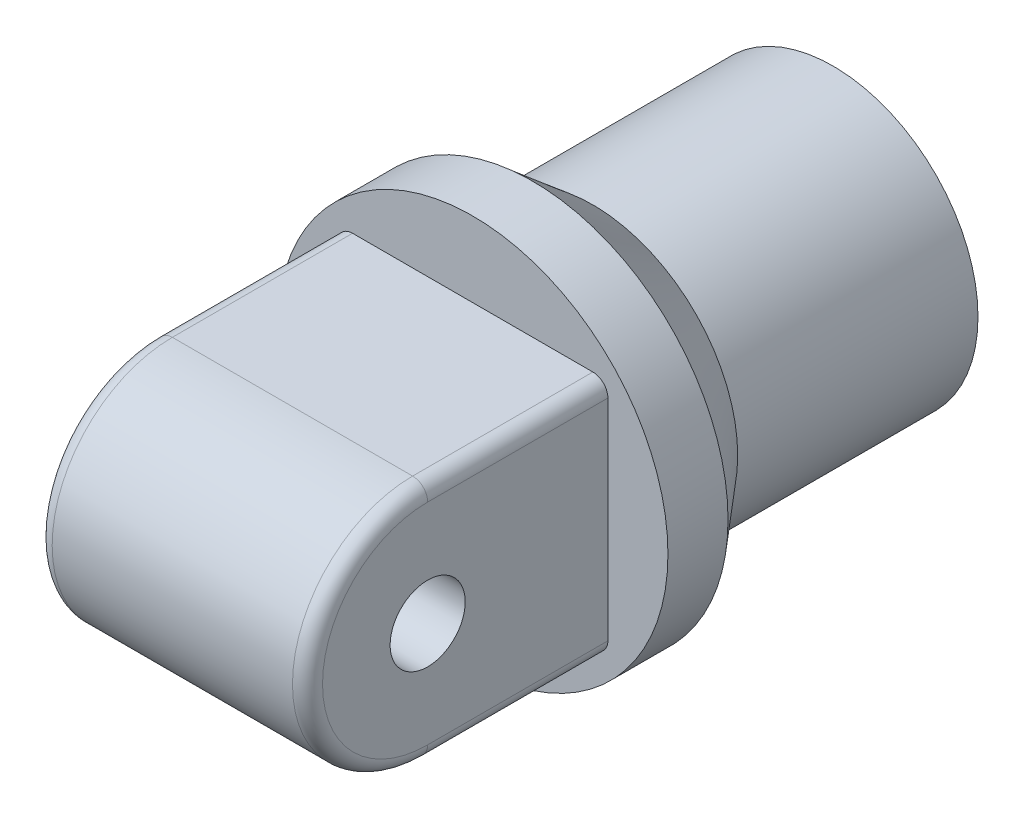
ISO-10303-21;
HEADER;
FILE_DESCRIPTION(('STEP AP214'),'2;1');
FILE_NAME('part.step','',(''),(''),'','','');
FILE_SCHEMA(('AUTOMOTIVE_DESIGN { 1 0 10303 214 1 1 1 1 }'));
ENDSEC;
DATA;
#1=APPLICATION_CONTEXT('core data for automotive mechanical design processes');
#2=APPLICATION_PROTOCOL_DEFINITION('international standard','automotive_design',2000,#1);
#3=PRODUCT_CONTEXT('',#1,'mechanical');
#4=PRODUCT('Part','Part','',(#3));
#5=PRODUCT_RELATED_PRODUCT_CATEGORY('part','',(#4));
#6=PRODUCT_DEFINITION_FORMATION('','',#4);
#7=PRODUCT_DEFINITION_CONTEXT('part definition',#1,'design');
#8=PRODUCT_DEFINITION('design','',#6,#7);
#9=PRODUCT_DEFINITION_SHAPE('','',#8);
#10=(LENGTH_UNIT() NAMED_UNIT(*) SI_UNIT(.MILLI.,.METRE.));
#11=(NAMED_UNIT(*) PLANE_ANGLE_UNIT() SI_UNIT($,.RADIAN.));
#12=(NAMED_UNIT(*) SI_UNIT($,.STERADIAN.) SOLID_ANGLE_UNIT());
#13=UNCERTAINTY_MEASURE_WITH_UNIT(LENGTH_MEASURE(1.E-05),#10,'distance_accuracy_value','');
#14=(GEOMETRIC_REPRESENTATION_CONTEXT(3) GLOBAL_UNCERTAINTY_ASSIGNED_CONTEXT((#13)) GLOBAL_UNIT_ASSIGNED_CONTEXT((#10,
#11,#12)) REPRESENTATION_CONTEXT('',''));
#15=CARTESIAN_POINT('',(0.,0.,0.));
#16=DIRECTION('',(0.,0.,1.));
#17=DIRECTION('',(1.,0.,0.));
#18=AXIS2_PLACEMENT_3D('',#15,#16,#17);
#19=CARTESIAN_POINT('',(0.,0.,-10.));
#20=DIRECTION('',(0.,0.,1.));
#21=DIRECTION('',(1.,0.,0.));
#22=AXIS2_PLACEMENT_3D('',#19,#20,#21);
#23=CYLINDRICAL_SURFACE('',#22,4.82180073764544);
#24=CARTESIAN_POINT('',(0.,0.,-10.));
#25=DIRECTION('',(0.,0.,1.));
#26=DIRECTION('',(1.,0.,0.));
#27=AXIS2_PLACEMENT_3D('',#24,#25,#26);
#28=CIRCLE('',#27,4.82180073764544);
#29=CARTESIAN_POINT('',(4.82180073764544,0.,-10.));
#30=VERTEX_POINT('',#29);
#31=EDGE_CURVE('E154',#30,#30,#28,.T.);
#32=ORIENTED_EDGE('',*,*,#31,.T.);
#33=EDGE_LOOP('',(#32));
#34=FACE_BOUND('',#33,.T.);
#35=CARTESIAN_POINT('',(0.,0.,-2.));
#36=DIRECTION('',(0.,0.,1.));
#37=DIRECTION('',(1.,0.,0.));
#38=AXIS2_PLACEMENT_3D('',#35,#36,#37);
#39=CIRCLE('',#38,4.82180073764544);
#40=CARTESIAN_POINT('',(4.82180073764544,0.,-2.));
#41=VERTEX_POINT('',#40);
#42=EDGE_CURVE('E139',#41,#41,#39,.T.);
#43=ORIENTED_EDGE('',*,*,#42,.F.);
#44=EDGE_LOOP('',(#43));
#45=FACE_BOUND('',#44,.T.);
#46=ADVANCED_FACE('F34',(#34,#45),#23,.T.);
#47=CARTESIAN_POINT('',(4.82180073764544,0.,-10.));
#48=DIRECTION('',(0.,0.,-1.));
#49=DIRECTION('',(-1.,0.,0.));
#50=AXIS2_PLACEMENT_3D('',#47,#48,#49);
#51=PLANE('',#50);
#52=ORIENTED_EDGE('',*,*,#31,.F.);
#53=EDGE_LOOP('',(#52));
#54=FACE_BOUND('',#53,.T.);
#55=ADVANCED_FACE('F224',(#54),#51,.T.);
#56=CARTESIAN_POINT('',(0.,0.,2.));
#57=DIRECTION('',(0.,0.,1.));
#58=DIRECTION('',(1.,0.,0.));
#59=AXIS2_PLACEMENT_3D('',#56,#57,#58);
#60=PLANE('',#59);
#61=DIRECTION('',(0.,1.,0.));
#62=VECTOR('',#61,1.);
#63=CARTESIAN_POINT('',(4.5,-4.,2.));
#64=LINE('',#63,#62);
#65=CARTESIAN_POINT('',(4.5,-3.5,2.));
#66=VERTEX_POINT('',#65);
#67=CARTESIAN_POINT('',(4.5,3.5,2.));
#68=VERTEX_POINT('',#67);
#69=EDGE_CURVE('E114',#66,#68,#64,.T.);
#70=ORIENTED_EDGE('',*,*,#69,.F.);
#71=CARTESIAN_POINT('',(4.,-3.5,2.));
#72=DIRECTION('',(0.,0.,1.));
#73=DIRECTION('',(1.,0.,0.));
#74=AXIS2_PLACEMENT_3D('',#71,#72,#73);
#75=CIRCLE('',#74,0.5);
#76=CARTESIAN_POINT('',(4.,-4.,2.));
#77=VERTEX_POINT('',#76);
#78=EDGE_CURVE('E99',#66,#77,#75,.F.);
#79=ORIENTED_EDGE('',*,*,#78,.T.);
#80=DIRECTION('',(1.,0.,0.));
#81=VECTOR('',#80,1.);
#82=CARTESIAN_POINT('',(-4.5,-4.,2.));
#83=LINE('',#82,#81);
#84=CARTESIAN_POINT('',(-4.,-4.,2.));
#85=VERTEX_POINT('',#84);
#86=EDGE_CURVE('E142',#85,#77,#83,.T.);
#87=ORIENTED_EDGE('',*,*,#86,.F.);
#88=CARTESIAN_POINT('',(-4.,-3.5,2.));
#89=DIRECTION('',(0.,0.,1.));
#90=DIRECTION('',(1.,0.,0.));
#91=AXIS2_PLACEMENT_3D('',#88,#89,#90);
#92=CIRCLE('',#91,0.5);
#93=CARTESIAN_POINT('',(-4.5,-3.5,2.));
#94=VERTEX_POINT('',#93);
#95=EDGE_CURVE('E43',#85,#94,#92,.F.);
#96=ORIENTED_EDGE('',*,*,#95,.T.);
#97=DIRECTION('',(0.,1.,0.));
#98=VECTOR('',#97,1.);
#99=CARTESIAN_POINT('',(-4.5,-4.,2.));
#100=LINE('',#99,#98);
#101=CARTESIAN_POINT('',(-4.5,3.5,2.));
#102=VERTEX_POINT('',#101);
#103=EDGE_CURVE('E125',#94,#102,#100,.T.);
#104=ORIENTED_EDGE('',*,*,#103,.T.);
#105=CARTESIAN_POINT('',(-4.,3.5,2.));
#106=DIRECTION('',(0.,0.,1.));
#107=DIRECTION('',(1.,0.,0.));
#108=AXIS2_PLACEMENT_3D('',#105,#106,#107);
#109=CIRCLE('',#108,0.5);
#110=CARTESIAN_POINT('',(-4.,4.,2.));
#111=VERTEX_POINT('',#110);
#112=EDGE_CURVE('E11',#102,#111,#109,.F.);
#113=ORIENTED_EDGE('',*,*,#112,.T.);
#114=DIRECTION('',(1.,0.,0.));
#115=VECTOR('',#114,1.);
#116=CARTESIAN_POINT('',(-4.5,4.,2.));
#117=LINE('',#116,#115);
#118=CARTESIAN_POINT('',(4.,4.,2.));
#119=VERTEX_POINT('',#118);
#120=EDGE_CURVE('E140',#111,#119,#117,.T.);
#121=ORIENTED_EDGE('',*,*,#120,.T.);
#122=CARTESIAN_POINT('',(4.,3.5,2.));
#123=DIRECTION('',(0.,0.,1.));
#124=DIRECTION('',(1.,0.,0.));
#125=AXIS2_PLACEMENT_3D('',#122,#123,#124);
#126=CIRCLE('',#125,0.5);
#127=EDGE_CURVE('E109',#119,#68,#126,.F.);
#128=ORIENTED_EDGE('',*,*,#127,.T.);
#129=EDGE_LOOP('',(#70,#79,#87,#96,#104,#113,#121,#128));
#130=FACE_BOUND('',#129,.T.);
#131=CARTESIAN_POINT('',(0.,0.,2.));
#132=DIRECTION('',(0.,0.,1.));
#133=DIRECTION('',(1.,0.,0.));
#134=AXIS2_PLACEMENT_3D('',#131,#132,#133);
#135=CIRCLE('',#134,6.5);
#136=CARTESIAN_POINT('',(6.5,0.,2.));
#137=VERTEX_POINT('',#136);
#138=EDGE_CURVE('E151',#137,#137,#135,.T.);
#139=ORIENTED_EDGE('',*,*,#138,.T.);
#140=EDGE_LOOP('',(#139));
#141=FACE_BOUND('',#140,.T.);
#142=ADVANCED_FACE('F121',(#130,#141),#60,.T.);
#143=CARTESIAN_POINT('',(0.,0.,-10.));
#144=DIRECTION('',(0.,0.,1.));
#145=DIRECTION('',(1.,0.,0.));
#146=AXIS2_PLACEMENT_3D('',#143,#144,#145);
#147=CYLINDRICAL_SURFACE('',#146,6.5);
#148=CARTESIAN_POINT('',(0.,0.,0.));
#149=DIRECTION('',(0.,0.,1.));
#150=DIRECTION('',(1.,0.,0.));
#151=AXIS2_PLACEMENT_3D('',#148,#149,#150);
#152=CIRCLE('',#151,6.5);
#153=CARTESIAN_POINT('',(6.5,0.,0.));
#154=VERTEX_POINT('',#153);
#155=EDGE_CURVE('E148',#154,#154,#152,.T.);
#156=ORIENTED_EDGE('',*,*,#155,.T.);
#157=EDGE_LOOP('',(#156));
#158=FACE_BOUND('',#157,.T.);
#159=ORIENTED_EDGE('',*,*,#138,.F.);
#160=EDGE_LOOP('',(#159));
#161=FACE_BOUND('',#160,.T.);
#162=ADVANCED_FACE('F312',(#158,#161),#147,.T.);
#163=CARTESIAN_POINT('',(0.,0.,0.));
#164=DIRECTION('',(0.,0.,1.));
#165=DIRECTION('',(1.,0.,0.));
#166=AXIS2_PLACEMENT_3D('',#163,#164,#165);
#167=CONICAL_SURFACE('',#166,6.5,0.698131700797732);
#168=ORIENTED_EDGE('',*,*,#42,.T.);
#169=EDGE_LOOP('',(#168));
#170=FACE_BOUND('',#169,.T.);
#171=ORIENTED_EDGE('',*,*,#155,.F.);
#172=EDGE_LOOP('',(#171));
#173=FACE_BOUND('',#172,.T.);
#174=ADVANCED_FACE('F220',(#170,#173),#167,.T.);
#175=CARTESIAN_POINT('',(-4.5,0.,8.));
#176=DIRECTION('',(1.,0.,0.));
#177=DIRECTION('',(0.,0.,-1.));
#178=AXIS2_PLACEMENT_3D('',#175,#176,#177);
#179=CYLINDRICAL_SURFACE('',#178,4.);
#180=DIRECTION('',(1.,0.,0.));
#181=VECTOR('',#180,1.);
#182=CARTESIAN_POINT('',(-4.5,-4.,8.));
#183=LINE('',#182,#181);
#184=CARTESIAN_POINT('',(-4.,-4.,8.));
#185=VERTEX_POINT('',#184);
#186=CARTESIAN_POINT('',(4.,-4.,8.));
#187=VERTEX_POINT('',#186);
#188=EDGE_CURVE('E129',#185,#187,#183,.T.);
#189=ORIENTED_EDGE('',*,*,#188,.T.);
#190=CARTESIAN_POINT('',(4.,0.,8.));
#191=DIRECTION('',(1.,0.,0.));
#192=DIRECTION('',(0.,0.,-1.));
#193=AXIS2_PLACEMENT_3D('',#190,#191,#192);
#194=CIRCLE('',#193,4.);
#195=CARTESIAN_POINT('',(4.,4.,8.));
#196=VERTEX_POINT('',#195);
#197=EDGE_CURVE('E165',#187,#196,#194,.F.);
#198=ORIENTED_EDGE('',*,*,#197,.T.);
#199=DIRECTION('',(1.,0.,0.));
#200=VECTOR('',#199,1.);
#201=CARTESIAN_POINT('',(-4.5,4.,8.));
#202=LINE('',#201,#200);
#203=CARTESIAN_POINT('',(-4.,4.,8.));
#204=VERTEX_POINT('',#203);
#205=EDGE_CURVE('E136',#204,#196,#202,.T.);
#206=ORIENTED_EDGE('',*,*,#205,.F.);
#207=CARTESIAN_POINT('',(-4.,0.,8.));
#208=DIRECTION('',(1.,0.,0.));
#209=DIRECTION('',(0.,0.,-1.));
#210=AXIS2_PLACEMENT_3D('',#207,#208,#209);
#211=CIRCLE('',#210,4.);
#212=EDGE_CURVE('E163',#204,#185,#211,.T.);
#213=ORIENTED_EDGE('',*,*,#212,.T.);
#214=EDGE_LOOP('',(#189,#198,#206,#213));
#215=FACE_BOUND('',#214,.T.);
#216=ADVANCED_FACE('F203',(#215),#179,.T.);
#217=CARTESIAN_POINT('',(-4.5,4.,2.));
#218=DIRECTION('',(0.,1.,0.));
#219=DIRECTION('',(0.,0.,1.));
#220=AXIS2_PLACEMENT_3D('',#217,#218,#219);
#221=PLANE('',#220);
#222=ORIENTED_EDGE('',*,*,#205,.T.);
#223=DIRECTION('',(0.,0.,1.));
#224=VECTOR('',#223,1.);
#225=CARTESIAN_POINT('',(4.,4.,2.));
#226=LINE('',#225,#224);
#227=EDGE_CURVE('E169',#196,#119,#226,.F.);
#228=ORIENTED_EDGE('',*,*,#227,.T.);
#229=ORIENTED_EDGE('',*,*,#120,.F.);
#230=DIRECTION('',(0.,0.,1.));
#231=VECTOR('',#230,1.);
#232=CARTESIAN_POINT('',(-4.,4.,8.));
#233=LINE('',#232,#231);
#234=EDGE_CURVE('E167',#111,#204,#233,.T.);
#235=ORIENTED_EDGE('',*,*,#234,.T.);
#236=EDGE_LOOP('',(#222,#228,#229,#235));
#237=FACE_BOUND('',#236,.T.);
#238=ADVANCED_FACE('F212',(#237),#221,.T.);
#239=CARTESIAN_POINT('',(-4.5,-4.,8.));
#240=DIRECTION('',(0.,-1.,0.));
#241=DIRECTION('',(0.,0.,-1.));
#242=AXIS2_PLACEMENT_3D('',#239,#240,#241);
#243=PLANE('',#242);
#244=ORIENTED_EDGE('',*,*,#86,.T.);
#245=DIRECTION('',(0.,0.,-1.));
#246=VECTOR('',#245,1.);
#247=CARTESIAN_POINT('',(4.,-4.,8.));
#248=LINE('',#247,#246);
#249=EDGE_CURVE('E104',#77,#187,#248,.F.);
#250=ORIENTED_EDGE('',*,*,#249,.T.);
#251=ORIENTED_EDGE('',*,*,#188,.F.);
#252=DIRECTION('',(0.,0.,-1.));
#253=VECTOR('',#252,1.);
#254=CARTESIAN_POINT('',(-4.,-4.,2.));
#255=LINE('',#254,#253);
#256=EDGE_CURVE('E119',#185,#85,#255,.T.);
#257=ORIENTED_EDGE('',*,*,#256,.T.);
#258=EDGE_LOOP('',(#244,#250,#251,#257));
#259=FACE_BOUND('',#258,.T.);
#260=ADVANCED_FACE('F200',(#259),#243,.T.);
#261=CARTESIAN_POINT('',(-4.5,0.,8.));
#262=DIRECTION('',(1.,0.,0.));
#263=DIRECTION('',(0.,0.,-1.));
#264=AXIS2_PLACEMENT_3D('',#261,#262,#263);
#265=PLANE('',#264);
#266=ORIENTED_EDGE('',*,*,#103,.F.);
#267=DIRECTION('',(0.,0.,-1.));
#268=VECTOR('',#267,1.);
#269=CARTESIAN_POINT('',(-4.5,-3.5,8.));
#270=LINE('',#269,#268);
#271=CARTESIAN_POINT('',(-4.5,-3.5,8.));
#272=VERTEX_POINT('',#271);
#273=EDGE_CURVE('E56',#94,#272,#270,.F.);
#274=ORIENTED_EDGE('',*,*,#273,.T.);
#275=CARTESIAN_POINT('',(-4.5,0.,8.));
#276=DIRECTION('',(1.,0.,0.));
#277=DIRECTION('',(0.,0.,-1.));
#278=AXIS2_PLACEMENT_3D('',#275,#276,#277);
#279=CIRCLE('',#278,3.5);
#280=CARTESIAN_POINT('',(-4.5,3.5,8.));
#281=VERTEX_POINT('',#280);
#282=EDGE_CURVE('E51',#272,#281,#279,.F.);
#283=ORIENTED_EDGE('',*,*,#282,.T.);
#284=DIRECTION('',(0.,0.,1.));
#285=VECTOR('',#284,1.);
#286=CARTESIAN_POINT('',(-4.5,3.5,2.));
#287=LINE('',#286,#285);
#288=EDGE_CURVE('E172',#281,#102,#287,.F.);
#289=ORIENTED_EDGE('',*,*,#288,.T.);
#290=EDGE_LOOP('',(#266,#274,#283,#289));
#291=FACE_BOUND('',#290,.T.);
#292=CARTESIAN_POINT('',(-4.5,0.,8.));
#293=DIRECTION('',(-1.,0.,0.));
#294=DIRECTION('',(0.,0.,1.));
#295=AXIS2_PLACEMENT_3D('',#292,#293,#294);
#296=CIRCLE('',#295,1.24999999999999);
#297=CARTESIAN_POINT('',(-4.5,0.,9.24999999999999));
#298=VERTEX_POINT('',#297);
#299=EDGE_CURVE('E132',#298,#298,#296,.T.);
#300=ORIENTED_EDGE('',*,*,#299,.F.);
#301=EDGE_LOOP('',(#300));
#302=FACE_BOUND('',#301,.T.);
#303=ADVANCED_FACE('F194',(#291,#302),#265,.F.);
#304=CARTESIAN_POINT('',(4.5,0.,8.));
#305=DIRECTION('',(1.,0.,0.));
#306=DIRECTION('',(0.,0.,-1.));
#307=AXIS2_PLACEMENT_3D('',#304,#305,#306);
#308=PLANE('',#307);
#309=CARTESIAN_POINT('',(4.5,0.,8.));
#310=DIRECTION('',(1.,0.,0.));
#311=DIRECTION('',(0.,0.,-1.));
#312=AXIS2_PLACEMENT_3D('',#309,#310,#311);
#313=CIRCLE('',#312,1.24999999999999);
#314=CARTESIAN_POINT('',(4.5,0.,6.75000000000001));
#315=VERTEX_POINT('',#314);
#316=EDGE_CURVE('E126',#315,#315,#313,.T.);
#317=ORIENTED_EDGE('',*,*,#316,.F.);
#318=EDGE_LOOP('',(#317));
#319=FACE_BOUND('',#318,.T.);
#320=CARTESIAN_POINT('',(4.5,0.,8.));
#321=DIRECTION('',(1.,0.,0.));
#322=DIRECTION('',(0.,0.,-1.));
#323=AXIS2_PLACEMENT_3D('',#320,#321,#322);
#324=CIRCLE('',#323,3.5);
#325=CARTESIAN_POINT('',(4.5,3.5,8.));
#326=VERTEX_POINT('',#325);
#327=CARTESIAN_POINT('',(4.5,-3.5,8.));
#328=VERTEX_POINT('',#327);
#329=EDGE_CURVE('E117',#326,#328,#324,.T.);
#330=ORIENTED_EDGE('',*,*,#329,.T.);
#331=DIRECTION('',(0.,0.,-1.));
#332=VECTOR('',#331,1.);
#333=CARTESIAN_POINT('',(4.5,-3.5,8.));
#334=LINE('',#333,#332);
#335=EDGE_CURVE('E103',#328,#66,#334,.T.);
#336=ORIENTED_EDGE('',*,*,#335,.T.);
#337=ORIENTED_EDGE('',*,*,#69,.T.);
#338=DIRECTION('',(0.,0.,1.));
#339=VECTOR('',#338,1.);
#340=CARTESIAN_POINT('',(4.5,3.5,8.));
#341=LINE('',#340,#339);
#342=EDGE_CURVE('E156',#68,#326,#341,.T.);
#343=ORIENTED_EDGE('',*,*,#342,.T.);
#344=EDGE_LOOP('',(#330,#336,#337,#343));
#345=FACE_BOUND('',#344,.T.);
#346=ADVANCED_FACE('F113',(#319,#345),#308,.T.);
#347=CARTESIAN_POINT('',(-4.5,0.,8.));
#348=DIRECTION('',(-1.,0.,0.));
#349=DIRECTION('',(0.,0.,1.));
#350=AXIS2_PLACEMENT_3D('',#347,#348,#349);
#351=CYLINDRICAL_SURFACE('',#350,1.24999999999999);
#352=ORIENTED_EDGE('',*,*,#316,.T.);
#353=EDGE_LOOP('',(#352));
#354=FACE_BOUND('',#353,.T.);
#355=ORIENTED_EDGE('',*,*,#299,.T.);
#356=EDGE_LOOP('',(#355));
#357=FACE_BOUND('',#356,.T.);
#358=ADVANCED_FACE('F241',(#354,#357),#351,.F.);
#359=CARTESIAN_POINT('',(4.,3.5,8.));
#360=DIRECTION('',(0.,0.,1.));
#361=DIRECTION('',(1.,0.,0.));
#362=AXIS2_PLACEMENT_3D('',#359,#360,#361);
#363=CYLINDRICAL_SURFACE('',#362,0.5);
#364=ORIENTED_EDGE('',*,*,#127,.F.);
#365=ORIENTED_EDGE('',*,*,#227,.F.);
#366=CARTESIAN_POINT('',(4.,3.5,8.));
#367=DIRECTION('',(0.,0.,1.));
#368=DIRECTION('',(1.,0.,0.));
#369=AXIS2_PLACEMENT_3D('',#366,#367,#368);
#370=CIRCLE('',#369,0.5);
#371=EDGE_CURVE('E179',#326,#196,#370,.T.);
#372=ORIENTED_EDGE('',*,*,#371,.F.);
#373=ORIENTED_EDGE('',*,*,#342,.F.);
#374=EDGE_LOOP('',(#364,#365,#372,#373));
#375=FACE_BOUND('',#374,.T.);
#376=ADVANCED_FACE('F210',(#375),#363,.T.);
#377=CARTESIAN_POINT('',(4.,0.,8.));
#378=DIRECTION('',(1.,0.,0.));
#379=DIRECTION('',(0.,0.,-1.));
#380=AXIS2_PLACEMENT_3D('',#377,#378,#379);
#381=TOROIDAL_SURFACE('',#380,3.5,0.5);
#382=ORIENTED_EDGE('',*,*,#371,.T.);
#383=ORIENTED_EDGE('',*,*,#197,.F.);
#384=CARTESIAN_POINT('',(4.,-3.5,8.));
#385=DIRECTION('',(0.,0.,-1.));
#386=DIRECTION('',(-1.,0.,0.));
#387=AXIS2_PLACEMENT_3D('',#384,#385,#386);
#388=CIRCLE('',#387,0.5);
#389=EDGE_CURVE('E177',#328,#187,#388,.T.);
#390=ORIENTED_EDGE('',*,*,#389,.F.);
#391=ORIENTED_EDGE('',*,*,#329,.F.);
#392=EDGE_LOOP('',(#382,#383,#390,#391));
#393=FACE_BOUND('',#392,.T.);
#394=ADVANCED_FACE('F206',(#393),#381,.T.);
#395=CARTESIAN_POINT('',(4.,-3.5,8.));
#396=DIRECTION('',(0.,0.,-1.));
#397=DIRECTION('',(0.,1.,0.));
#398=AXIS2_PLACEMENT_3D('',#395,#396,#397);
#399=CYLINDRICAL_SURFACE('',#398,0.5);
#400=ORIENTED_EDGE('',*,*,#389,.T.);
#401=ORIENTED_EDGE('',*,*,#249,.F.);
#402=ORIENTED_EDGE('',*,*,#78,.F.);
#403=ORIENTED_EDGE('',*,*,#335,.F.);
#404=EDGE_LOOP('',(#400,#401,#402,#403));
#405=FACE_BOUND('',#404,.T.);
#406=ADVANCED_FACE('F102',(#405),#399,.T.);
#407=CARTESIAN_POINT('',(-4.,3.5,2.));
#408=DIRECTION('',(0.,0.,-1.));
#409=DIRECTION('',(-1.,0.,0.));
#410=AXIS2_PLACEMENT_3D('',#407,#408,#409);
#411=CYLINDRICAL_SURFACE('',#410,0.5);
#412=ORIENTED_EDGE('',*,*,#112,.F.);
#413=ORIENTED_EDGE('',*,*,#288,.F.);
#414=CARTESIAN_POINT('',(-4.,3.5,8.));
#415=DIRECTION('',(0.,0.,1.));
#416=DIRECTION('',(1.,0.,0.));
#417=AXIS2_PLACEMENT_3D('',#414,#415,#416);
#418=CIRCLE('',#417,0.5);
#419=EDGE_CURVE('E38',#204,#281,#418,.T.);
#420=ORIENTED_EDGE('',*,*,#419,.F.);
#421=ORIENTED_EDGE('',*,*,#234,.F.);
#422=EDGE_LOOP('',(#412,#413,#420,#421));
#423=FACE_BOUND('',#422,.T.);
#424=ADVANCED_FACE('F36',(#423),#411,.T.);
#425=CARTESIAN_POINT('',(-4.,0.,8.));
#426=DIRECTION('',(1.,0.,0.));
#427=DIRECTION('',(0.,0.,-1.));
#428=AXIS2_PLACEMENT_3D('',#425,#426,#427);
#429=TOROIDAL_SURFACE('',#428,3.5,0.5);
#430=ORIENTED_EDGE('',*,*,#419,.T.);
#431=ORIENTED_EDGE('',*,*,#282,.F.);
#432=CARTESIAN_POINT('',(-4.,-3.5,8.));
#433=DIRECTION('',(0.,0.,-1.));
#434=DIRECTION('',(-1.,0.,0.));
#435=AXIS2_PLACEMENT_3D('',#432,#433,#434);
#436=CIRCLE('',#435,0.5);
#437=EDGE_CURVE('E181',#185,#272,#436,.T.);
#438=ORIENTED_EDGE('',*,*,#437,.F.);
#439=ORIENTED_EDGE('',*,*,#212,.F.);
#440=EDGE_LOOP('',(#430,#431,#438,#439));
#441=FACE_BOUND('',#440,.T.);
#442=ADVANCED_FACE('F190',(#441),#429,.T.);
#443=CARTESIAN_POINT('',(-4.,-3.5,8.));
#444=DIRECTION('',(0.,0.,1.));
#445=DIRECTION('',(0.,-1.,0.));
#446=AXIS2_PLACEMENT_3D('',#443,#444,#445);
#447=CYLINDRICAL_SURFACE('',#446,0.5);
#448=ORIENTED_EDGE('',*,*,#437,.T.);
#449=ORIENTED_EDGE('',*,*,#273,.F.);
#450=ORIENTED_EDGE('',*,*,#95,.F.);
#451=ORIENTED_EDGE('',*,*,#256,.F.);
#452=EDGE_LOOP('',(#448,#449,#450,#451));
#453=FACE_BOUND('',#452,.T.);
#454=ADVANCED_FACE('F197',(#453),#447,.T.);
#455=CLOSED_SHELL('',(#46,#55,#142,#162,#174,#216,#238,#260,#303,#346,#358,#376,#394,#406,#424,
#442,#454));
#456=MANIFOLD_SOLID_BREP('B2',#455);
#457=ADVANCED_BREP_SHAPE_REPRESENTATION('',(#18,#456),#14);
#458=SHAPE_DEFINITION_REPRESENTATION(#9,#457);
ENDSEC;
END-ISO-10303-21;
